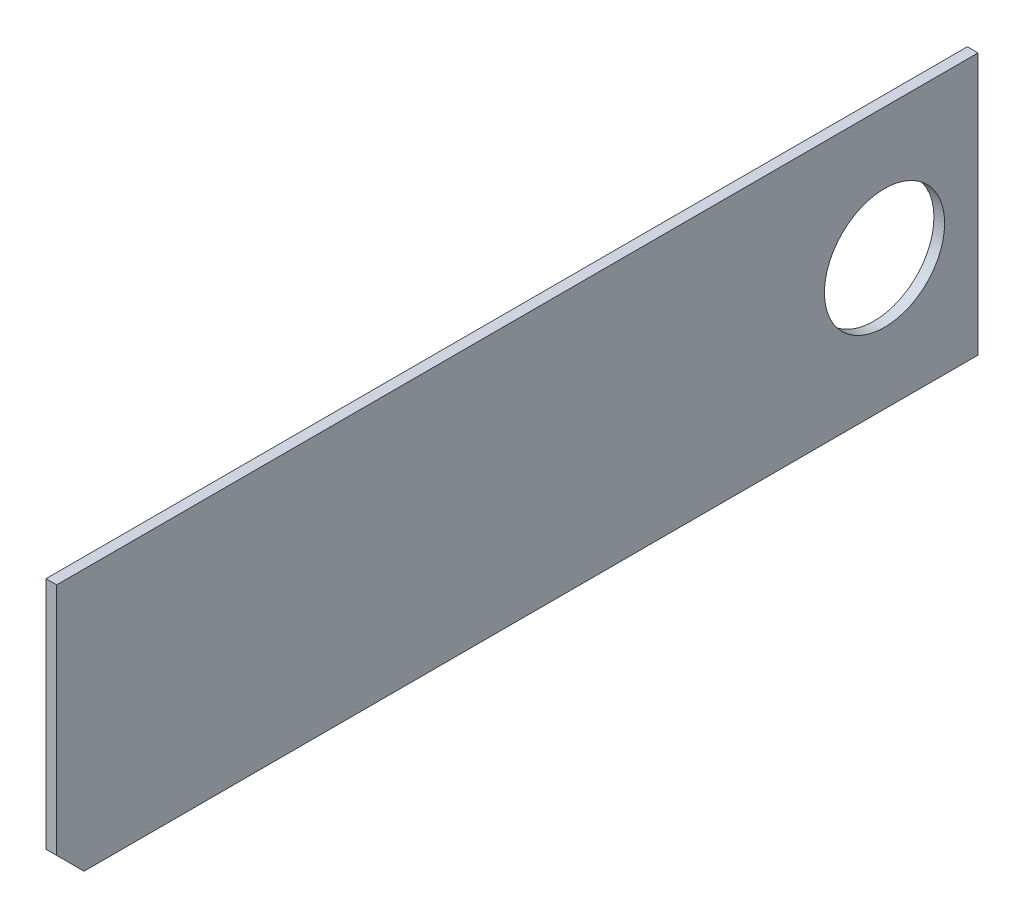
ISO-10303-21;
HEADER;
FILE_DESCRIPTION(('STEP AP214'),'2;1');
FILE_NAME('part.step','',(''),(''),'','','');
FILE_SCHEMA(('AUTOMOTIVE_DESIGN { 1 0 10303 214 1 1 1 1 }'));
ENDSEC;
DATA;
#1=APPLICATION_CONTEXT('core data for automotive mechanical design processes');
#2=APPLICATION_PROTOCOL_DEFINITION('international standard','automotive_design',2000,#1);
#3=PRODUCT_CONTEXT('',#1,'mechanical');
#4=PRODUCT('Part','Part','',(#3));
#5=PRODUCT_RELATED_PRODUCT_CATEGORY('part','',(#4));
#6=PRODUCT_DEFINITION_FORMATION('','',#4);
#7=PRODUCT_DEFINITION_CONTEXT('part definition',#1,'design');
#8=PRODUCT_DEFINITION('design','',#6,#7);
#9=PRODUCT_DEFINITION_SHAPE('','',#8);
#10=(LENGTH_UNIT() NAMED_UNIT(*) SI_UNIT(.MILLI.,.METRE.));
#11=(NAMED_UNIT(*) PLANE_ANGLE_UNIT() SI_UNIT($,.RADIAN.));
#12=(NAMED_UNIT(*) SI_UNIT($,.STERADIAN.) SOLID_ANGLE_UNIT());
#13=UNCERTAINTY_MEASURE_WITH_UNIT(LENGTH_MEASURE(1.E-05),#10,'distance_accuracy_value','');
#14=(GEOMETRIC_REPRESENTATION_CONTEXT(3) GLOBAL_UNCERTAINTY_ASSIGNED_CONTEXT((#13)) GLOBAL_UNIT_ASSIGNED_CONTEXT((#10,
#11,#12)) REPRESENTATION_CONTEXT('',''));
#15=CARTESIAN_POINT('',(0.,0.,0.));
#16=DIRECTION('',(0.,0.,1.));
#17=DIRECTION('',(1.,0.,0.));
#18=AXIS2_PLACEMENT_3D('',#15,#16,#17);
#19=CARTESIAN_POINT('',(8.,0.,0.));
#20=DIRECTION('',(1.,0.,0.));
#21=DIRECTION('',(0.,0.,-1.));
#22=AXIS2_PLACEMENT_3D('',#19,#20,#21);
#23=PLANE('',#22);
#24=DIRECTION('',(0.,1.,0.));
#25=VECTOR('',#24,1.);
#26=CARTESIAN_POINT('',(8.,98.,-70.));
#27=LINE('',#26,#25);
#28=CARTESIAN_POINT('',(8.,-98.,-70.0000000000001));
#29=VERTEX_POINT('',#28);
#30=CARTESIAN_POINT('',(8.,98.,-70.));
#31=VERTEX_POINT('',#30);
#32=EDGE_CURVE('E118',#29,#31,#27,.T.);
#33=ORIENTED_EDGE('',*,*,#32,.T.);
#34=DIRECTION('',(0.,0.,1.));
#35=VECTOR('',#34,1.);
#36=CARTESIAN_POINT('',(8.,98.,-70.));
#37=LINE('',#36,#35);
#38=CARTESIAN_POINT('',(8.,97.9999999999999,620.));
#39=VERTEX_POINT('',#38);
#40=EDGE_CURVE('E85',#31,#39,#37,.T.);
#41=ORIENTED_EDGE('',*,*,#40,.T.);
#42=DIRECTION('',(0.,-1.,0.));
#43=VECTOR('',#42,1.);
#44=CARTESIAN_POINT('',(8.,97.9999999999999,620.));
#45=LINE('',#44,#43);
#46=CARTESIAN_POINT('',(8.,-77.5000000000007,620.));
#47=VERTEX_POINT('',#46);
#48=EDGE_CURVE('E89',#39,#47,#45,.T.);
#49=ORIENTED_EDGE('',*,*,#48,.T.);
#50=DIRECTION('',(0.,-0.707106781186549,-0.707106781186546));
#51=VECTOR('',#50,1.);
#52=CARTESIAN_POINT('',(8.,-77.5000000000007,620.));
#53=LINE('',#52,#51);
#54=CARTESIAN_POINT('',(8.,-98.,599.500000000001));
#55=VERTEX_POINT('',#54);
#56=EDGE_CURVE('E93',#47,#55,#53,.T.);
#57=ORIENTED_EDGE('',*,*,#56,.T.);
#58=DIRECTION('',(0.,0.,-1.));
#59=VECTOR('',#58,1.);
#60=CARTESIAN_POINT('',(8.,-98.,599.500000000001));
#61=LINE('',#60,#59);
#62=EDGE_CURVE('E51',#55,#29,#61,.T.);
#63=ORIENTED_EDGE('',*,*,#62,.T.);
#64=EDGE_LOOP('',(#33,#41,#49,#57,#63));
#65=FACE_BOUND('',#64,.T.);
#66=CARTESIAN_POINT('',(8.,0.,0.));
#67=DIRECTION('',(1.,0.,0.));
#68=DIRECTION('',(0.,0.,-1.));
#69=AXIS2_PLACEMENT_3D('',#66,#67,#68);
#70=CIRCLE('',#69,45.);
#71=CARTESIAN_POINT('',(8.,0.,-45.));
#72=VERTEX_POINT('',#71);
#73=EDGE_CURVE('E113',#72,#72,#70,.T.);
#74=ORIENTED_EDGE('',*,*,#73,.F.);
#75=EDGE_LOOP('',(#74));
#76=FACE_BOUND('',#75,.T.);
#77=ADVANCED_FACE('F34',(#65,#76),#23,.T.);
#78=CARTESIAN_POINT('',(0.,0.,0.));
#79=DIRECTION('',(1.,0.,0.));
#80=DIRECTION('',(0.,0.,-1.));
#81=AXIS2_PLACEMENT_3D('',#78,#79,#80);
#82=PLANE('',#81);
#83=DIRECTION('',(0.,1.,0.));
#84=VECTOR('',#83,1.);
#85=CARTESIAN_POINT('',(0.,98.,-70.));
#86=LINE('',#85,#84);
#87=CARTESIAN_POINT('',(0.,-98.,-70.0000000000001));
#88=VERTEX_POINT('',#87);
#89=CARTESIAN_POINT('',(0.,98.,-70.));
#90=VERTEX_POINT('',#89);
#91=EDGE_CURVE('E109',#88,#90,#86,.T.);
#92=ORIENTED_EDGE('',*,*,#91,.F.);
#93=DIRECTION('',(0.,0.,-1.));
#94=VECTOR('',#93,1.);
#95=CARTESIAN_POINT('',(0.,-98.,599.500000000001));
#96=LINE('',#95,#94);
#97=CARTESIAN_POINT('',(0.,-98.,599.500000000001));
#98=VERTEX_POINT('',#97);
#99=EDGE_CURVE('E77',#98,#88,#96,.T.);
#100=ORIENTED_EDGE('',*,*,#99,.F.);
#101=DIRECTION('',(0.,-0.707106781186549,-0.707106781186546));
#102=VECTOR('',#101,1.);
#103=CARTESIAN_POINT('',(0.,-77.5000000000007,620.));
#104=LINE('',#103,#102);
#105=CARTESIAN_POINT('',(0.,-77.5000000000007,620.));
#106=VERTEX_POINT('',#105);
#107=EDGE_CURVE('E71',#106,#98,#104,.T.);
#108=ORIENTED_EDGE('',*,*,#107,.F.);
#109=DIRECTION('',(0.,-1.,0.));
#110=VECTOR('',#109,1.);
#111=CARTESIAN_POINT('',(0.,97.9999999999999,620.));
#112=LINE('',#111,#110);
#113=CARTESIAN_POINT('',(0.,97.9999999999999,620.));
#114=VERTEX_POINT('',#113);
#115=EDGE_CURVE('E100',#114,#106,#112,.T.);
#116=ORIENTED_EDGE('',*,*,#115,.F.);
#117=DIRECTION('',(0.,0.,1.));
#118=VECTOR('',#117,1.);
#119=CARTESIAN_POINT('',(0.,98.,-70.));
#120=LINE('',#119,#118);
#121=EDGE_CURVE('E112',#90,#114,#120,.T.);
#122=ORIENTED_EDGE('',*,*,#121,.F.);
#123=EDGE_LOOP('',(#92,#100,#108,#116,#122));
#124=FACE_BOUND('',#123,.T.);
#125=CARTESIAN_POINT('',(0.,0.,0.));
#126=DIRECTION('',(1.,0.,0.));
#127=DIRECTION('',(0.,0.,-1.));
#128=AXIS2_PLACEMENT_3D('',#125,#126,#127);
#129=CIRCLE('',#128,45.);
#130=CARTESIAN_POINT('',(0.,0.,-45.));
#131=VERTEX_POINT('',#130);
#132=EDGE_CURVE('E198',#131,#131,#129,.T.);
#133=ORIENTED_EDGE('',*,*,#132,.T.);
#134=EDGE_LOOP('',(#133));
#135=FACE_BOUND('',#134,.T.);
#136=ADVANCED_FACE('F122',(#124,#135),#82,.F.);
#137=CARTESIAN_POINT('',(8.,98.,-70.));
#138=DIRECTION('',(0.,0.,1.));
#139=DIRECTION('',(0.,-1.,0.));
#140=AXIS2_PLACEMENT_3D('',#137,#138,#139);
#141=PLANE('',#140);
#142=ORIENTED_EDGE('',*,*,#91,.T.);
#143=DIRECTION('',(-1.,0.,0.));
#144=VECTOR('',#143,1.);
#145=CARTESIAN_POINT('',(8.,98.,-70.));
#146=LINE('',#145,#144);
#147=EDGE_CURVE('E11',#31,#90,#146,.T.);
#148=ORIENTED_EDGE('',*,*,#147,.F.);
#149=ORIENTED_EDGE('',*,*,#32,.F.);
#150=DIRECTION('',(-1.,0.,0.));
#151=VECTOR('',#150,1.);
#152=CARTESIAN_POINT('',(8.,-98.,-70.0000000000001));
#153=LINE('',#152,#151);
#154=EDGE_CURVE('E105',#29,#88,#153,.T.);
#155=ORIENTED_EDGE('',*,*,#154,.T.);
#156=EDGE_LOOP('',(#142,#148,#149,#155));
#157=FACE_BOUND('',#156,.T.);
#158=ADVANCED_FACE('F36',(#157),#141,.F.);
#159=CARTESIAN_POINT('',(8.,98.,-70.));
#160=DIRECTION('',(0.,-1.,0.));
#161=DIRECTION('',(0.,0.,-1.));
#162=AXIS2_PLACEMENT_3D('',#159,#160,#161);
#163=PLANE('',#162);
#164=ORIENTED_EDGE('',*,*,#121,.T.);
#165=DIRECTION('',(-1.,0.,0.));
#166=VECTOR('',#165,1.);
#167=CARTESIAN_POINT('',(8.,97.9999999999999,620.));
#168=LINE('',#167,#166);
#169=EDGE_CURVE('E43',#39,#114,#168,.T.);
#170=ORIENTED_EDGE('',*,*,#169,.F.);
#171=ORIENTED_EDGE('',*,*,#40,.F.);
#172=ORIENTED_EDGE('',*,*,#147,.T.);
#173=EDGE_LOOP('',(#164,#170,#171,#172));
#174=FACE_BOUND('',#173,.T.);
#175=ADVANCED_FACE('F147',(#174),#163,.F.);
#176=CARTESIAN_POINT('',(8.,97.9999999999999,620.));
#177=DIRECTION('',(0.,0.,-1.));
#178=DIRECTION('',(-1.,0.,0.));
#179=AXIS2_PLACEMENT_3D('',#176,#177,#178);
#180=PLANE('',#179);
#181=ORIENTED_EDGE('',*,*,#115,.T.);
#182=DIRECTION('',(-1.,0.,0.));
#183=VECTOR('',#182,1.);
#184=CARTESIAN_POINT('',(8.,-77.5000000000007,620.));
#185=LINE('',#184,#183);
#186=EDGE_CURVE('E97',#47,#106,#185,.T.);
#187=ORIENTED_EDGE('',*,*,#186,.F.);
#188=ORIENTED_EDGE('',*,*,#48,.F.);
#189=ORIENTED_EDGE('',*,*,#169,.T.);
#190=EDGE_LOOP('',(#181,#187,#188,#189));
#191=FACE_BOUND('',#190,.T.);
#192=ADVANCED_FACE('F98',(#191),#180,.F.);
#193=CARTESIAN_POINT('',(8.,-77.5000000000007,620.));
#194=DIRECTION('',(0.,0.707106781186546,-0.707106781186549));
#195=DIRECTION('',(0.,0.707106781186549,0.707106781186546));
#196=AXIS2_PLACEMENT_3D('',#193,#194,#195);
#197=PLANE('',#196);
#198=ORIENTED_EDGE('',*,*,#107,.T.);
#199=DIRECTION('',(-1.,0.,0.));
#200=VECTOR('',#199,1.);
#201=CARTESIAN_POINT('',(8.,-98.,599.500000000001));
#202=LINE('',#201,#200);
#203=EDGE_CURVE('E101',#55,#98,#202,.T.);
#204=ORIENTED_EDGE('',*,*,#203,.F.);
#205=ORIENTED_EDGE('',*,*,#56,.F.);
#206=ORIENTED_EDGE('',*,*,#186,.T.);
#207=EDGE_LOOP('',(#198,#204,#205,#206));
#208=FACE_BOUND('',#207,.T.);
#209=ADVANCED_FACE('F103',(#208),#197,.F.);
#210=CARTESIAN_POINT('',(8.,-98.,599.500000000001));
#211=DIRECTION('',(0.,1.,0.));
#212=DIRECTION('',(0.,0.,1.));
#213=AXIS2_PLACEMENT_3D('',#210,#211,#212);
#214=PLANE('',#213);
#215=ORIENTED_EDGE('',*,*,#99,.T.);
#216=ORIENTED_EDGE('',*,*,#154,.F.);
#217=ORIENTED_EDGE('',*,*,#62,.F.);
#218=ORIENTED_EDGE('',*,*,#203,.T.);
#219=EDGE_LOOP('',(#215,#216,#217,#218));
#220=FACE_BOUND('',#219,.T.);
#221=ADVANCED_FACE('F127',(#220),#214,.F.);
#222=CARTESIAN_POINT('',(8.,0.,0.));
#223=DIRECTION('',(-1.,0.,0.));
#224=DIRECTION('',(0.,0.,1.));
#225=AXIS2_PLACEMENT_3D('',#222,#223,#224);
#226=CYLINDRICAL_SURFACE('',#225,45.);
#227=ORIENTED_EDGE('',*,*,#73,.T.);
#228=EDGE_LOOP('',(#227));
#229=FACE_BOUND('',#228,.T.);
#230=ORIENTED_EDGE('',*,*,#132,.F.);
#231=EDGE_LOOP('',(#230));
#232=FACE_BOUND('',#231,.T.);
#233=ADVANCED_FACE('F129',(#229,#232),#226,.F.);
#234=CLOSED_SHELL('',(#77,#136,#158,#175,#192,#209,#221,#233));
#235=MANIFOLD_SOLID_BREP('B2',#234);
#236=ADVANCED_BREP_SHAPE_REPRESENTATION('',(#18,#235),#14);
#237=SHAPE_DEFINITION_REPRESENTATION(#9,#236);
ENDSEC;
END-ISO-10303-21;
